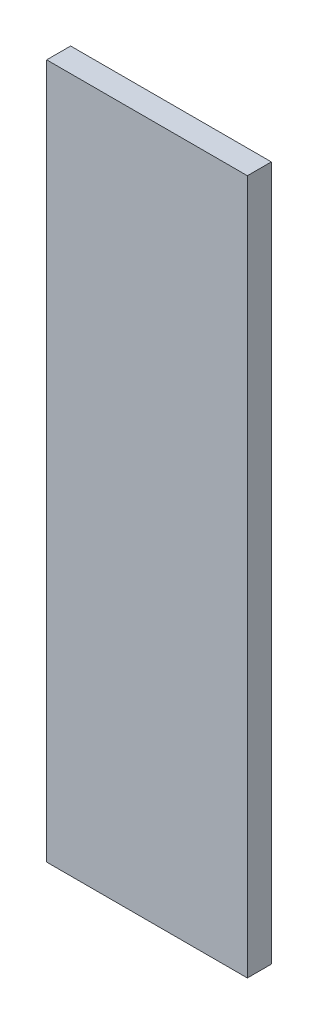
ISO-10303-21;
HEADER;
FILE_DESCRIPTION(('STEP AP214'),'2;1');
FILE_NAME('part.step','',(''),(''),'','','');
FILE_SCHEMA(('AUTOMOTIVE_DESIGN { 1 0 10303 214 1 1 1 1 }'));
ENDSEC;
DATA;
#1=APPLICATION_CONTEXT('core data for automotive mechanical design processes');
#2=APPLICATION_PROTOCOL_DEFINITION('international standard','automotive_design',2000,#1);
#3=PRODUCT_CONTEXT('',#1,'mechanical');
#4=PRODUCT('Part','Part','',(#3));
#5=PRODUCT_RELATED_PRODUCT_CATEGORY('part','',(#4));
#6=PRODUCT_DEFINITION_FORMATION('','',#4);
#7=PRODUCT_DEFINITION_CONTEXT('part definition',#1,'design');
#8=PRODUCT_DEFINITION('design','',#6,#7);
#9=PRODUCT_DEFINITION_SHAPE('','',#8);
#10=(LENGTH_UNIT() NAMED_UNIT(*) SI_UNIT(.MILLI.,.METRE.));
#11=(NAMED_UNIT(*) PLANE_ANGLE_UNIT() SI_UNIT($,.RADIAN.));
#12=(NAMED_UNIT(*) SI_UNIT($,.STERADIAN.) SOLID_ANGLE_UNIT());
#13=UNCERTAINTY_MEASURE_WITH_UNIT(LENGTH_MEASURE(1.E-05),#10,'distance_accuracy_value','');
#14=(GEOMETRIC_REPRESENTATION_CONTEXT(3) GLOBAL_UNCERTAINTY_ASSIGNED_CONTEXT((#13)) GLOBAL_UNIT_ASSIGNED_CONTEXT((#10,
#11,#12)) REPRESENTATION_CONTEXT('',''));
#15=CARTESIAN_POINT('',(0.,0.,0.));
#16=DIRECTION('',(0.,0.,1.));
#17=DIRECTION('',(1.,0.,0.));
#18=AXIS2_PLACEMENT_3D('',#15,#16,#17);
#19=CARTESIAN_POINT('',(-14.2788461538462,-14.7,0.5));
#20=DIRECTION('',(1.,0.,0.));
#21=DIRECTION('',(0.,0.,-1.));
#22=AXIS2_PLACEMENT_3D('',#19,#20,#21);
#23=PLANE('',#22);
#24=DIRECTION('',(0.,1.,0.));
#25=VECTOR('',#24,1.);
#26=CARTESIAN_POINT('',(-14.2788461538462,-14.7,0.5));
#27=LINE('',#26,#25);
#28=CARTESIAN_POINT('',(-14.2788461538462,0.5,0.5));
#29=VERTEX_POINT('',#28);
#30=CARTESIAN_POINT('',(-14.2788461538462,15.,0.5));
#31=VERTEX_POINT('',#30);
#32=EDGE_CURVE('E43',#29,#31,#27,.T.);
#33=ORIENTED_EDGE('',*,*,#32,.F.);
#34=DIRECTION('',(0.,0.,1.));
#35=VECTOR('',#34,1.);
#36=CARTESIAN_POINT('',(-14.2788461538462,0.5,0.5));
#37=LINE('',#36,#35);
#38=CARTESIAN_POINT('',(-14.2788461538462,0.5,1.));
#39=VERTEX_POINT('',#38);
#40=EDGE_CURVE('E57',#29,#39,#37,.T.);
#41=ORIENTED_EDGE('',*,*,#40,.T.);
#42=DIRECTION('',(0.,1.,0.));
#43=VECTOR('',#42,1.);
#44=CARTESIAN_POINT('',(-14.2788461538462,-14.7,1.));
#45=LINE('',#44,#43);
#46=CARTESIAN_POINT('',(-14.2788461538462,15.,1.));
#47=VERTEX_POINT('',#46);
#48=EDGE_CURVE('E89',#39,#47,#45,.T.);
#49=ORIENTED_EDGE('',*,*,#48,.T.);
#50=DIRECTION('',(0.,0.,1.));
#51=VECTOR('',#50,1.);
#52=CARTESIAN_POINT('',(-14.2788461538462,15.,0.5));
#53=LINE('',#52,#51);
#54=EDGE_CURVE('E47',#31,#47,#53,.T.);
#55=ORIENTED_EDGE('',*,*,#54,.F.);
#56=EDGE_LOOP('',(#33,#41,#49,#55));
#57=FACE_BOUND('',#56,.T.);
#58=ADVANCED_FACE('F39',(#57),#23,.F.);
#59=CARTESIAN_POINT('',(-10.0903846153846,15.,0.5));
#60=DIRECTION('',(-1.,0.,0.));
#61=DIRECTION('',(0.,0.,1.));
#62=AXIS2_PLACEMENT_3D('',#59,#60,#61);
#63=PLANE('',#62);
#64=DIRECTION('',(0.,-1.,0.));
#65=VECTOR('',#64,1.);
#66=CARTESIAN_POINT('',(-10.0903846153846,15.,1.));
#67=LINE('',#66,#65);
#68=CARTESIAN_POINT('',(-10.0903846153846,15.,1.));
#69=VERTEX_POINT('',#68);
#70=CARTESIAN_POINT('',(-10.0903846153846,0.5,1.));
#71=VERTEX_POINT('',#70);
#72=EDGE_CURVE('E84',#69,#71,#67,.T.);
#73=ORIENTED_EDGE('',*,*,#72,.T.);
#74=DIRECTION('',(0.,0.,-1.));
#75=VECTOR('',#74,1.);
#76=CARTESIAN_POINT('',(-10.0903846153846,0.5,0.5));
#77=LINE('',#76,#75);
#78=CARTESIAN_POINT('',(-10.0903846153846,0.5,0.5));
#79=VERTEX_POINT('',#78);
#80=EDGE_CURVE('E73',#71,#79,#77,.T.);
#81=ORIENTED_EDGE('',*,*,#80,.T.);
#82=DIRECTION('',(0.,-1.,0.));
#83=VECTOR('',#82,1.);
#84=CARTESIAN_POINT('',(-10.0903846153846,15.,0.5));
#85=LINE('',#84,#83);
#86=CARTESIAN_POINT('',(-10.0903846153846,15.,0.5));
#87=VERTEX_POINT('',#86);
#88=EDGE_CURVE('E95',#87,#79,#85,.T.);
#89=ORIENTED_EDGE('',*,*,#88,.F.);
#90=DIRECTION('',(0.,0.,1.));
#91=VECTOR('',#90,1.);
#92=CARTESIAN_POINT('',(-10.0903846153846,15.,0.5));
#93=LINE('',#92,#91);
#94=EDGE_CURVE('E81',#87,#69,#93,.T.);
#95=ORIENTED_EDGE('',*,*,#94,.T.);
#96=EDGE_LOOP('',(#73,#81,#89,#95));
#97=FACE_BOUND('',#96,.T.);
#98=ADVANCED_FACE('F94',(#97),#63,.F.);
#99=CARTESIAN_POINT('',(0.659899487595896,8.31878205226073,0.5));
#100=DIRECTION('',(0.,0.,-1.));
#101=DIRECTION('',(-1.,0.,0.));
#102=AXIS2_PLACEMENT_3D('',#99,#100,#101);
#103=PLANE('',#102);
#104=DIRECTION('',(1.,0.,0.));
#105=VECTOR('',#104,1.);
#106=CARTESIAN_POINT('',(0.659899487595896,0.5,0.5));
#107=LINE('',#106,#105);
#108=EDGE_CURVE('E11',#29,#79,#107,.T.);
#109=ORIENTED_EDGE('',*,*,#108,.F.);
#110=ORIENTED_EDGE('',*,*,#32,.T.);
#111=DIRECTION('',(1.,0.,0.));
#112=VECTOR('',#111,1.);
#113=CARTESIAN_POINT('',(-14.2788461538462,15.,0.5));
#114=LINE('',#113,#112);
#115=EDGE_CURVE('E98',#31,#87,#114,.T.);
#116=ORIENTED_EDGE('',*,*,#115,.T.);
#117=ORIENTED_EDGE('',*,*,#88,.T.);
#118=EDGE_LOOP('',(#109,#110,#116,#117));
#119=FACE_BOUND('',#118,.T.);
#120=ADVANCED_FACE('F108',(#119),#103,.T.);
#121=CARTESIAN_POINT('',(0.659899487595896,8.31878205226073,1.));
#122=DIRECTION('',(0.,0.,-1.));
#123=DIRECTION('',(-1.,0.,0.));
#124=AXIS2_PLACEMENT_3D('',#121,#122,#123);
#125=PLANE('',#124);
#126=ORIENTED_EDGE('',*,*,#48,.F.);
#127=DIRECTION('',(1.,0.,0.));
#128=VECTOR('',#127,1.);
#129=CARTESIAN_POINT('',(-17.,0.5,1.));
#130=LINE('',#129,#128);
#131=EDGE_CURVE('E76',#39,#71,#130,.T.);
#132=ORIENTED_EDGE('',*,*,#131,.T.);
#133=ORIENTED_EDGE('',*,*,#72,.F.);
#134=DIRECTION('',(1.,0.,0.));
#135=VECTOR('',#134,1.);
#136=CARTESIAN_POINT('',(-14.2788461538462,15.,1.));
#137=LINE('',#136,#135);
#138=EDGE_CURVE('E91',#47,#69,#137,.T.);
#139=ORIENTED_EDGE('',*,*,#138,.F.);
#140=EDGE_LOOP('',(#126,#132,#133,#139));
#141=FACE_BOUND('',#140,.T.);
#142=ADVANCED_FACE('F41',(#141),#125,.F.);
#143=CARTESIAN_POINT('',(-14.2788461538462,15.,0.5));
#144=DIRECTION('',(0.,-1.,0.));
#145=DIRECTION('',(0.,0.,-1.));
#146=AXIS2_PLACEMENT_3D('',#143,#144,#145);
#147=PLANE('',#146);
#148=ORIENTED_EDGE('',*,*,#138,.T.);
#149=ORIENTED_EDGE('',*,*,#94,.F.);
#150=ORIENTED_EDGE('',*,*,#115,.F.);
#151=ORIENTED_EDGE('',*,*,#54,.T.);
#152=EDGE_LOOP('',(#148,#149,#150,#151));
#153=FACE_BOUND('',#152,.T.);
#154=ADVANCED_FACE('F120',(#153),#147,.F.);
#155=CARTESIAN_POINT('',(-17.,0.5,1.));
#156=DIRECTION('',(0.,1.,0.));
#157=DIRECTION('',(0.,0.,1.));
#158=AXIS2_PLACEMENT_3D('',#155,#156,#157);
#159=PLANE('',#158);
#160=ORIENTED_EDGE('',*,*,#108,.T.);
#161=ORIENTED_EDGE('',*,*,#80,.F.);
#162=ORIENTED_EDGE('',*,*,#131,.F.);
#163=ORIENTED_EDGE('',*,*,#40,.F.);
#164=EDGE_LOOP('',(#160,#161,#162,#163));
#165=FACE_BOUND('',#164,.T.);
#166=ADVANCED_FACE('F77',(#165),#159,.F.);
#167=CLOSED_SHELL('',(#58,#98,#120,#142,#154,#166));
#168=MANIFOLD_SOLID_BREP('B2',#167);
#169=ADVANCED_BREP_SHAPE_REPRESENTATION('',(#18,#168),#14);
#170=SHAPE_DEFINITION_REPRESENTATION(#9,#169);
ENDSEC;
END-ISO-10303-21;
